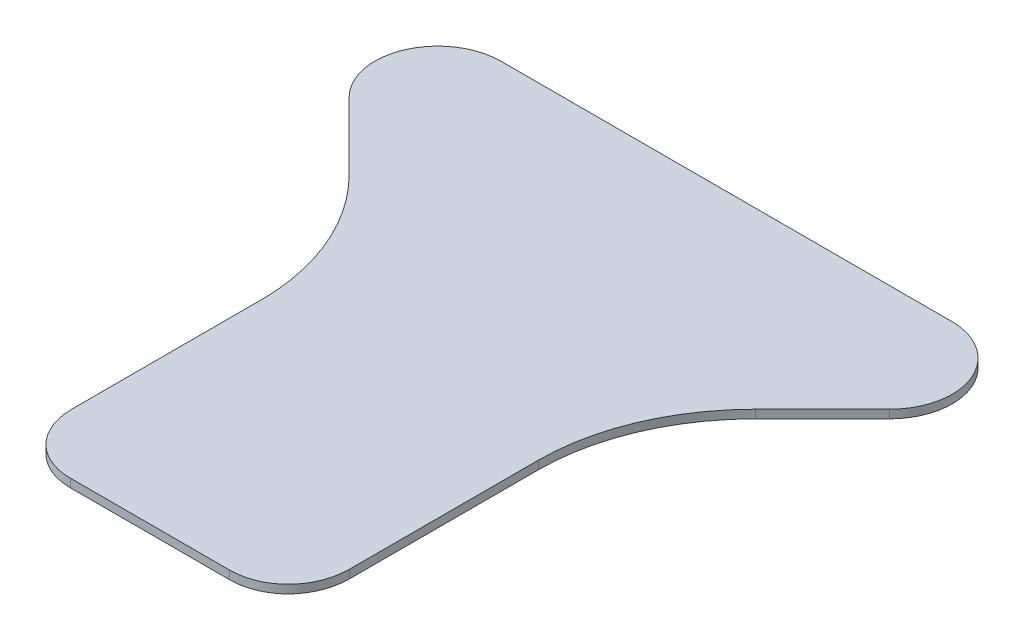
ISO-10303-21;
HEADER;
FILE_DESCRIPTION(('STEP AP214'),'2;1');
FILE_NAME('part.step','',(''),(''),'','','');
FILE_SCHEMA(('AUTOMOTIVE_DESIGN { 1 0 10303 214 1 1 1 1 }'));
ENDSEC;
DATA;
#1=APPLICATION_CONTEXT('core data for automotive mechanical design processes');
#2=APPLICATION_PROTOCOL_DEFINITION('international standard','automotive_design',2000,#1);
#3=PRODUCT_CONTEXT('',#1,'mechanical');
#4=PRODUCT('Part','Part','',(#3));
#5=PRODUCT_RELATED_PRODUCT_CATEGORY('part','',(#4));
#6=PRODUCT_DEFINITION_FORMATION('','',#4);
#7=PRODUCT_DEFINITION_CONTEXT('part definition',#1,'design');
#8=PRODUCT_DEFINITION('design','',#6,#7);
#9=PRODUCT_DEFINITION_SHAPE('','',#8);
#10=(LENGTH_UNIT() NAMED_UNIT(*) SI_UNIT(.MILLI.,.METRE.));
#11=(NAMED_UNIT(*) PLANE_ANGLE_UNIT() SI_UNIT($,.RADIAN.));
#12=(NAMED_UNIT(*) SI_UNIT($,.STERADIAN.) SOLID_ANGLE_UNIT());
#13=UNCERTAINTY_MEASURE_WITH_UNIT(LENGTH_MEASURE(1.E-05),#10,'distance_accuracy_value','');
#14=(GEOMETRIC_REPRESENTATION_CONTEXT(3) GLOBAL_UNCERTAINTY_ASSIGNED_CONTEXT((#13)) GLOBAL_UNIT_ASSIGNED_CONTEXT((#10,
#11,#12)) REPRESENTATION_CONTEXT('',''));
#15=CARTESIAN_POINT('',(0.,0.,0.));
#16=DIRECTION('',(0.,0.,1.));
#17=DIRECTION('',(1.,0.,0.));
#18=AXIS2_PLACEMENT_3D('',#15,#16,#17);
#19=CARTESIAN_POINT('',(84.8907420615577,-2.,16.1883201048479));
#20=DIRECTION('',(0.,-1.,0.));
#21=DIRECTION('',(0.8805517435296,0.,-0.473950025811774));
#22=AXIS2_PLACEMENT_3D('',#19,#20,#21);
#23=ELLIPSE('',#22,52.263673371764,50.);
#24=DIRECTION('',(0.,1.,0.));
#25=VECTOR('',#24,1.);
#26=SURFACE_OF_LINEAR_EXTRUSION('',#23,#25);
#27=CARTESIAN_POINT('',(84.8907420615577,0.,16.1883201048479));
#28=DIRECTION('',(0.,-1.,0.));
#29=DIRECTION('',(0.8805517435296,0.,-0.473950025811774));
#30=AXIS2_PLACEMENT_3D('',#27,#28,#29);
#31=ELLIPSE('',#30,52.263673371764,50.);
#32=CARTESIAN_POINT('',(33.1269330410536,0.,18.0546841412167));
#33=VERTEX_POINT('',#32);
#34=CARTESIAN_POINT('',(48.5022751971715,0.,-18.4039944524139));
#35=VERTEX_POINT('',#34);
#36=EDGE_CURVE('E257',#33,#35,#31,.T.);
#37=ORIENTED_EDGE('',*,*,#36,.F.);
#38=DIRECTION('',(0.,1.,0.));
#39=VECTOR('',#38,1.);
#40=CARTESIAN_POINT('',(33.1269330410536,-2.,18.0546841412167));
#41=LINE('',#40,#39);
#42=CARTESIAN_POINT('',(33.1269330410536,-2.,18.0546841412167));
#43=VERTEX_POINT('',#42);
#44=EDGE_CURVE('E11',#43,#33,#41,.T.);
#45=ORIENTED_EDGE('',*,*,#44,.F.);
#46=CARTESIAN_POINT('',(48.5022751971715,-2.,-18.4039944524139));
#47=VERTEX_POINT('',#46);
#48=EDGE_CURVE('E231',#43,#47,#23,.T.);
#49=ORIENTED_EDGE('',*,*,#48,.T.);
#50=DIRECTION('',(0.,1.,0.));
#51=VECTOR('',#50,1.);
#52=CARTESIAN_POINT('',(48.5022751971715,-2.,-18.4039944524139));
#53=LINE('',#52,#51);
#54=EDGE_CURVE('E37',#47,#35,#53,.T.);
#55=ORIENTED_EDGE('',*,*,#54,.T.);
#56=EDGE_LOOP('',(#37,#45,#49,#55));
#57=FACE_BOUND('',#56,.T.);
#58=ADVANCED_FACE('F33',(#57),#26,.T.);
#59=CARTESIAN_POINT('',(33.1269330410536,-2.,63.0937447596294));
#60=DIRECTION('',(1.,0.,0.));
#61=DIRECTION('',(0.,0.,-1.));
#62=AXIS2_PLACEMENT_3D('',#59,#60,#61);
#63=PLANE('',#62);
#64=DIRECTION('',(0.,0.,-1.));
#65=VECTOR('',#64,1.);
#66=CARTESIAN_POINT('',(33.1269330410536,0.,63.0937447596294));
#67=LINE('',#66,#65);
#68=CARTESIAN_POINT('',(33.1269330410536,0.,63.0937447596294));
#69=VERTEX_POINT('',#68);
#70=EDGE_CURVE('E214',#69,#33,#67,.T.);
#71=ORIENTED_EDGE('',*,*,#70,.F.);
#72=DIRECTION('',(0.,1.,0.));
#73=VECTOR('',#72,1.);
#74=CARTESIAN_POINT('',(33.1269330410536,-2.,63.0937447596294));
#75=LINE('',#74,#73);
#76=CARTESIAN_POINT('',(33.1269330410536,-2.,63.0937447596294));
#77=VERTEX_POINT('',#76);
#78=EDGE_CURVE('E43',#77,#69,#75,.T.);
#79=ORIENTED_EDGE('',*,*,#78,.F.);
#80=DIRECTION('',(0.,0.,-1.));
#81=VECTOR('',#80,1.);
#82=CARTESIAN_POINT('',(33.1269330410536,-2.,63.0937447596294));
#83=LINE('',#82,#81);
#84=EDGE_CURVE('E145',#77,#43,#83,.T.);
#85=ORIENTED_EDGE('',*,*,#84,.T.);
#86=ORIENTED_EDGE('',*,*,#44,.T.);
#87=EDGE_LOOP('',(#71,#79,#85,#86));
#88=FACE_BOUND('',#87,.T.);
#89=ADVANCED_FACE('F161',(#88),#63,.T.);
#90=CARTESIAN_POINT('',(17.5977903349023,-2.,61.6807083324516));
#91=DIRECTION('',(0.,1.,0.));
#92=DIRECTION('',(-0.592855683220724,0.,-0.805308722710048));
#93=AXIS2_PLACEMENT_3D('',#90,#91,#92);
#94=ELLIPSE('',#93,16.4608929818575,15.);
#95=DIRECTION('',(0.,1.,0.));
#96=VECTOR('',#95,1.);
#97=SURFACE_OF_LINEAR_EXTRUSION('',#94,#96);
#98=CARTESIAN_POINT('',(17.5977903349023,0.,61.6807083324516));
#99=DIRECTION('',(0.,1.,0.));
#100=DIRECTION('',(-0.592855683220724,0.,-0.805308722710048));
#101=AXIS2_PLACEMENT_3D('',#98,#99,#100);
#102=ELLIPSE('',#101,16.4608929818575,15.);
#103=CARTESIAN_POINT('',(18.9724506528917,0.,77.6433749195903));
#104=VERTEX_POINT('',#103);
#105=EDGE_CURVE('E132',#104,#69,#102,.T.);
#106=ORIENTED_EDGE('',*,*,#105,.F.);
#107=DIRECTION('',(0.,1.,0.));
#108=VECTOR('',#107,1.);
#109=CARTESIAN_POINT('',(18.9724506528917,-2.,77.6433749195903));
#110=LINE('',#109,#108);
#111=CARTESIAN_POINT('',(18.9724506528917,-2.,77.6433749195903));
#112=VERTEX_POINT('',#111);
#113=EDGE_CURVE('E127',#112,#104,#110,.T.);
#114=ORIENTED_EDGE('',*,*,#113,.F.);
#115=EDGE_CURVE('E130',#112,#77,#94,.T.);
#116=ORIENTED_EDGE('',*,*,#115,.T.);
#117=ORIENTED_EDGE('',*,*,#78,.T.);
#118=EDGE_LOOP('',(#106,#114,#116,#117));
#119=FACE_BOUND('',#118,.T.);
#120=ADVANCED_FACE('F129',(#119),#97,.T.);
#121=CARTESIAN_POINT('',(-18.9724506528917,-2.,77.6433749195903));
#122=DIRECTION('',(0.,0.,1.));
#123=DIRECTION('',(1.,0.,0.));
#124=AXIS2_PLACEMENT_3D('',#121,#122,#123);
#125=PLANE('',#124);
#126=DIRECTION('',(1.,0.,0.));
#127=VECTOR('',#126,1.);
#128=CARTESIAN_POINT('',(-18.9724506528917,0.,77.6433749195903));
#129=LINE('',#128,#127);
#130=CARTESIAN_POINT('',(-18.9724506528917,0.,77.6433749195903));
#131=VERTEX_POINT('',#130);
#132=EDGE_CURVE('E221',#131,#104,#129,.T.);
#133=ORIENTED_EDGE('',*,*,#132,.F.);
#134=DIRECTION('',(0.,1.,0.));
#135=VECTOR('',#134,1.);
#136=CARTESIAN_POINT('',(-18.9724506528917,-2.,77.6433749195903));
#137=LINE('',#136,#135);
#138=CARTESIAN_POINT('',(-18.9724506528917,-2.,77.6433749195903));
#139=VERTEX_POINT('',#138);
#140=EDGE_CURVE('E137',#139,#131,#137,.T.);
#141=ORIENTED_EDGE('',*,*,#140,.F.);
#142=DIRECTION('',(1.,0.,0.));
#143=VECTOR('',#142,1.);
#144=CARTESIAN_POINT('',(-18.9724506528917,-2.,77.6433749195903));
#145=LINE('',#144,#143);
#146=EDGE_CURVE('E143',#139,#112,#145,.T.);
#147=ORIENTED_EDGE('',*,*,#146,.T.);
#148=ORIENTED_EDGE('',*,*,#113,.T.);
#149=EDGE_LOOP('',(#133,#141,#147,#148));
#150=FACE_BOUND('',#149,.T.);
#151=ADVANCED_FACE('F147',(#150),#125,.T.);
#152=CARTESIAN_POINT('',(-17.5977903349023,-2.,61.6807083324516));
#153=DIRECTION('',(0.,1.,0.));
#154=DIRECTION('',(0.592855683220724,0.,-0.805308722710048));
#155=AXIS2_PLACEMENT_3D('',#152,#153,#154);
#156=ELLIPSE('',#155,16.4608929818575,15.);
#157=DIRECTION('',(0.,1.,0.));
#158=VECTOR('',#157,1.);
#159=SURFACE_OF_LINEAR_EXTRUSION('',#156,#158);
#160=CARTESIAN_POINT('',(-17.5977903349023,0.,61.6807083324516));
#161=DIRECTION('',(0.,1.,0.));
#162=DIRECTION('',(0.592855683220724,0.,-0.805308722710048));
#163=AXIS2_PLACEMENT_3D('',#160,#161,#162);
#164=ELLIPSE('',#163,16.4608929818575,15.);
#165=CARTESIAN_POINT('',(-33.1269330410536,0.,63.0937447596294));
#166=VERTEX_POINT('',#165);
#167=EDGE_CURVE('E219',#166,#131,#164,.T.);
#168=ORIENTED_EDGE('',*,*,#167,.F.);
#169=DIRECTION('',(0.,1.,0.));
#170=VECTOR('',#169,1.);
#171=CARTESIAN_POINT('',(-33.1269330410536,-2.,63.0937447596294));
#172=LINE('',#171,#170);
#173=CARTESIAN_POINT('',(-33.1269330410536,-2.,63.0937447596294));
#174=VERTEX_POINT('',#173);
#175=EDGE_CURVE('E189',#174,#166,#172,.T.);
#176=ORIENTED_EDGE('',*,*,#175,.F.);
#177=EDGE_CURVE('E148',#174,#139,#156,.T.);
#178=ORIENTED_EDGE('',*,*,#177,.T.);
#179=ORIENTED_EDGE('',*,*,#140,.T.);
#180=EDGE_LOOP('',(#168,#176,#178,#179));
#181=FACE_BOUND('',#180,.T.);
#182=ADVANCED_FACE('F165',(#181),#159,.T.);
#183=CARTESIAN_POINT('',(-33.1269330410536,-2.,18.0546841412167));
#184=DIRECTION('',(-1.,0.,0.));
#185=DIRECTION('',(0.,0.,1.));
#186=AXIS2_PLACEMENT_3D('',#183,#184,#185);
#187=PLANE('',#186);
#188=DIRECTION('',(0.,0.,1.));
#189=VECTOR('',#188,1.);
#190=CARTESIAN_POINT('',(-33.1269330410536,0.,18.0546841412167));
#191=LINE('',#190,#189);
#192=CARTESIAN_POINT('',(-33.1269330410536,0.,18.0546841412167));
#193=VERTEX_POINT('',#192);
#194=EDGE_CURVE('E226',#193,#166,#191,.T.);
#195=ORIENTED_EDGE('',*,*,#194,.F.);
#196=DIRECTION('',(0.,1.,0.));
#197=VECTOR('',#196,1.);
#198=CARTESIAN_POINT('',(-33.1269330410536,-2.,18.0546841412167));
#199=LINE('',#198,#197);
#200=CARTESIAN_POINT('',(-33.1269330410536,-2.,18.0546841412167));
#201=VERTEX_POINT('',#200);
#202=EDGE_CURVE('E191',#201,#193,#199,.T.);
#203=ORIENTED_EDGE('',*,*,#202,.F.);
#204=DIRECTION('',(0.,0.,1.));
#205=VECTOR('',#204,1.);
#206=CARTESIAN_POINT('',(-33.1269330410536,-2.,18.0546841412167));
#207=LINE('',#206,#205);
#208=EDGE_CURVE('E150',#201,#174,#207,.T.);
#209=ORIENTED_EDGE('',*,*,#208,.T.);
#210=ORIENTED_EDGE('',*,*,#175,.T.);
#211=EDGE_LOOP('',(#195,#203,#209,#210));
#212=FACE_BOUND('',#211,.T.);
#213=ADVANCED_FACE('F168',(#212),#187,.T.);
#214=CARTESIAN_POINT('',(-84.8907420615577,-2.,16.1883201048479));
#215=DIRECTION('',(0.,-1.,0.));
#216=DIRECTION('',(-0.8805517435296,0.,-0.473950025811774));
#217=AXIS2_PLACEMENT_3D('',#214,#215,#216);
#218=ELLIPSE('',#217,52.263673371764,50.);
#219=DIRECTION('',(0.,1.,0.));
#220=VECTOR('',#219,1.);
#221=SURFACE_OF_LINEAR_EXTRUSION('',#218,#220);
#222=CARTESIAN_POINT('',(-84.8907420615577,0.,16.1883201048479));
#223=DIRECTION('',(0.,-1.,0.));
#224=DIRECTION('',(-0.8805517435296,0.,-0.473950025811774));
#225=AXIS2_PLACEMENT_3D('',#222,#223,#224);
#226=ELLIPSE('',#225,52.263673371764,50.);
#227=CARTESIAN_POINT('',(-48.5022751971715,0.,-18.4039944524139));
#228=VERTEX_POINT('',#227);
#229=EDGE_CURVE('E198',#228,#193,#226,.T.);
#230=ORIENTED_EDGE('',*,*,#229,.F.);
#231=DIRECTION('',(0.,1.,0.));
#232=VECTOR('',#231,1.);
#233=CARTESIAN_POINT('',(-48.5022751971715,-2.,-18.4039944524139));
#234=LINE('',#233,#232);
#235=CARTESIAN_POINT('',(-48.5022751971715,-2.,-18.4039944524139));
#236=VERTEX_POINT('',#235);
#237=EDGE_CURVE('E196',#236,#228,#234,.T.);
#238=ORIENTED_EDGE('',*,*,#237,.F.);
#239=EDGE_CURVE('E180',#236,#201,#218,.T.);
#240=ORIENTED_EDGE('',*,*,#239,.T.);
#241=ORIENTED_EDGE('',*,*,#202,.T.);
#242=EDGE_LOOP('',(#230,#238,#240,#241));
#243=FACE_BOUND('',#242,.T.);
#244=ADVANCED_FACE('F172',(#243),#221,.T.);
#245=CARTESIAN_POINT('',(-64.5320403487164,-2.,-34.4337596039586));
#246=DIRECTION('',(-0.707106781186543,0.,0.707106781186552));
#247=DIRECTION('',(0.707106781186552,0.,0.707106781186543));
#248=AXIS2_PLACEMENT_3D('',#245,#246,#247);
#249=PLANE('',#248);
#250=DIRECTION('',(0.707106781186552,0.,0.707106781186543));
#251=VECTOR('',#250,1.);
#252=CARTESIAN_POINT('',(-64.5320403487164,0.,-34.4337596039586));
#253=LINE('',#252,#251);
#254=CARTESIAN_POINT('',(-64.5320403487164,0.,-34.4337596039586));
#255=VERTEX_POINT('',#254);
#256=EDGE_CURVE('E271',#255,#228,#253,.T.);
#257=ORIENTED_EDGE('',*,*,#256,.F.);
#258=DIRECTION('',(0.,1.,0.));
#259=VECTOR('',#258,1.);
#260=CARTESIAN_POINT('',(-64.5320403487164,-2.,-34.4337596039586));
#261=LINE('',#260,#259);
#262=CARTESIAN_POINT('',(-64.5320403487164,-2.,-34.4337596039586));
#263=VERTEX_POINT('',#262);
#264=EDGE_CURVE('E202',#263,#255,#261,.T.);
#265=ORIENTED_EDGE('',*,*,#264,.F.);
#266=DIRECTION('',(0.707106781186552,0.,0.707106781186543));
#267=VECTOR('',#266,1.);
#268=CARTESIAN_POINT('',(-64.5320403487164,-2.,-34.4337596039586));
#269=LINE('',#268,#267);
#270=EDGE_CURVE('E184',#263,#236,#269,.T.);
#271=ORIENTED_EDGE('',*,*,#270,.T.);
#272=ORIENTED_EDGE('',*,*,#237,.T.);
#273=EDGE_LOOP('',(#257,#265,#271,#272));
#274=FACE_BOUND('',#273,.T.);
#275=ADVANCED_FACE('F177',(#274),#249,.T.);
#276=CARTESIAN_POINT('',(-53.8040463182635,-2.,-45.));
#277=DIRECTION('',(0.,1.,0.));
#278=DIRECTION('',(1.,0.,0.));
#279=AXIS2_PLACEMENT_3D('',#276,#277,#278);
#280=ELLIPSE('',#279,15.1143779167552,15.);
#281=DIRECTION('',(0.,1.,0.));
#282=VECTOR('',#281,1.);
#283=SURFACE_OF_LINEAR_EXTRUSION('',#280,#282);
#284=CARTESIAN_POINT('',(-53.8040463182635,0.,-45.));
#285=DIRECTION('',(0.,1.,0.));
#286=DIRECTION('',(1.,0.,0.));
#287=AXIS2_PLACEMENT_3D('',#284,#285,#286);
#288=ELLIPSE('',#287,15.1143779167552,15.);
#289=CARTESIAN_POINT('',(-53.8040463182635,0.,-60.));
#290=VERTEX_POINT('',#289);
#291=EDGE_CURVE('E268',#290,#255,#288,.T.);
#292=ORIENTED_EDGE('',*,*,#291,.F.);
#293=DIRECTION('',(0.,1.,0.));
#294=VECTOR('',#293,1.);
#295=CARTESIAN_POINT('',(-53.8040463182635,-2.,-60.));
#296=LINE('',#295,#294);
#297=CARTESIAN_POINT('',(-53.8040463182635,-2.,-60.));
#298=VERTEX_POINT('',#297);
#299=EDGE_CURVE('E205',#298,#290,#296,.T.);
#300=ORIENTED_EDGE('',*,*,#299,.F.);
#301=EDGE_CURVE('E277',#298,#263,#280,.T.);
#302=ORIENTED_EDGE('',*,*,#301,.T.);
#303=ORIENTED_EDGE('',*,*,#264,.T.);
#304=EDGE_LOOP('',(#292,#300,#302,#303));
#305=FACE_BOUND('',#304,.T.);
#306=ADVANCED_FACE('F279',(#305),#283,.T.);
#307=CARTESIAN_POINT('',(53.8040463182635,-2.,-60.));
#308=DIRECTION('',(0.,0.,-1.));
#309=DIRECTION('',(-1.,0.,0.));
#310=AXIS2_PLACEMENT_3D('',#307,#308,#309);
#311=PLANE('',#310);
#312=DIRECTION('',(-1.,0.,0.));
#313=VECTOR('',#312,1.);
#314=CARTESIAN_POINT('',(53.8040463182635,0.,-60.));
#315=LINE('',#314,#313);
#316=CARTESIAN_POINT('',(53.8040463182635,0.,-60.));
#317=VERTEX_POINT('',#316);
#318=EDGE_CURVE('E265',#317,#290,#315,.T.);
#319=ORIENTED_EDGE('',*,*,#318,.F.);
#320=DIRECTION('',(0.,1.,0.));
#321=VECTOR('',#320,1.);
#322=CARTESIAN_POINT('',(53.8040463182635,-2.,-60.));
#323=LINE('',#322,#321);
#324=CARTESIAN_POINT('',(53.8040463182635,-2.,-60.));
#325=VERTEX_POINT('',#324);
#326=EDGE_CURVE('E210',#325,#317,#323,.T.);
#327=ORIENTED_EDGE('',*,*,#326,.F.);
#328=DIRECTION('',(-1.,0.,0.));
#329=VECTOR('',#328,1.);
#330=CARTESIAN_POINT('',(53.8040463182635,-2.,-60.));
#331=LINE('',#330,#329);
#332=EDGE_CURVE('E240',#325,#298,#331,.T.);
#333=ORIENTED_EDGE('',*,*,#332,.T.);
#334=ORIENTED_EDGE('',*,*,#299,.T.);
#335=EDGE_LOOP('',(#319,#327,#333,#334));
#336=FACE_BOUND('',#335,.T.);
#337=ADVANCED_FACE('F246',(#336),#311,.T.);
#338=CARTESIAN_POINT('',(53.8040463182635,-2.,-45.));
#339=DIRECTION('',(0.,1.,0.));
#340=DIRECTION('',(-1.,0.,0.));
#341=AXIS2_PLACEMENT_3D('',#338,#339,#340);
#342=ELLIPSE('',#341,15.1143779167552,15.);
#343=DIRECTION('',(0.,1.,0.));
#344=VECTOR('',#343,1.);
#345=SURFACE_OF_LINEAR_EXTRUSION('',#342,#344);
#346=CARTESIAN_POINT('',(53.8040463182635,0.,-45.));
#347=DIRECTION('',(0.,1.,0.));
#348=DIRECTION('',(-1.,0.,0.));
#349=AXIS2_PLACEMENT_3D('',#346,#347,#348);
#350=ELLIPSE('',#349,15.1143779167552,15.);
#351=CARTESIAN_POINT('',(64.5320403487164,0.,-34.4337596039586));
#352=VERTEX_POINT('',#351);
#353=EDGE_CURVE('E260',#352,#317,#350,.T.);
#354=ORIENTED_EDGE('',*,*,#353,.F.);
#355=DIRECTION('',(0.,1.,0.));
#356=VECTOR('',#355,1.);
#357=CARTESIAN_POINT('',(64.5320403487164,-2.,-34.4337596039586));
#358=LINE('',#357,#356);
#359=CARTESIAN_POINT('',(64.5320403487164,-2.,-34.4337596039586));
#360=VERTEX_POINT('',#359);
#361=EDGE_CURVE('E211',#360,#352,#358,.T.);
#362=ORIENTED_EDGE('',*,*,#361,.F.);
#363=EDGE_CURVE('E233',#360,#325,#342,.T.);
#364=ORIENTED_EDGE('',*,*,#363,.T.);
#365=ORIENTED_EDGE('',*,*,#326,.T.);
#366=EDGE_LOOP('',(#354,#362,#364,#365));
#367=FACE_BOUND('',#366,.T.);
#368=ADVANCED_FACE('F242',(#367),#345,.T.);
#369=CARTESIAN_POINT('',(48.5022751971715,-2.,-18.4039944524139));
#370=DIRECTION('',(0.707106781186543,0.,0.707106781186552));
#371=DIRECTION('',(0.707106781186552,0.,-0.707106781186543));
#372=AXIS2_PLACEMENT_3D('',#369,#370,#371);
#373=PLANE('',#372);
#374=DIRECTION('',(0.707106781186552,0.,-0.707106781186543));
#375=VECTOR('',#374,1.);
#376=CARTESIAN_POINT('',(48.5022751971715,0.,-18.4039944524139));
#377=LINE('',#376,#375);
#378=EDGE_CURVE('E259',#35,#352,#377,.T.);
#379=ORIENTED_EDGE('',*,*,#378,.F.);
#380=ORIENTED_EDGE('',*,*,#54,.F.);
#381=DIRECTION('',(0.707106781186552,0.,-0.707106781186543));
#382=VECTOR('',#381,1.);
#383=CARTESIAN_POINT('',(48.5022751971715,-2.,-18.4039944524139));
#384=LINE('',#383,#382);
#385=EDGE_CURVE('E232',#47,#360,#384,.T.);
#386=ORIENTED_EDGE('',*,*,#385,.T.);
#387=ORIENTED_EDGE('',*,*,#361,.T.);
#388=EDGE_LOOP('',(#379,#380,#386,#387));
#389=FACE_BOUND('',#388,.T.);
#390=ADVANCED_FACE('F245',(#389),#373,.T.);
#391=CARTESIAN_POINT('',(84.8907420615577,-2.,16.1883201048479));
#392=DIRECTION('',(0.,1.,0.));
#393=DIRECTION('',(0.,0.,1.));
#394=AXIS2_PLACEMENT_3D('',#391,#392,#393);
#395=PLANE('',#394);
#396=ORIENTED_EDGE('',*,*,#48,.F.);
#397=ORIENTED_EDGE('',*,*,#84,.F.);
#398=ORIENTED_EDGE('',*,*,#115,.F.);
#399=ORIENTED_EDGE('',*,*,#146,.F.);
#400=ORIENTED_EDGE('',*,*,#177,.F.);
#401=ORIENTED_EDGE('',*,*,#208,.F.);
#402=ORIENTED_EDGE('',*,*,#239,.F.);
#403=ORIENTED_EDGE('',*,*,#270,.F.);
#404=ORIENTED_EDGE('',*,*,#301,.F.);
#405=ORIENTED_EDGE('',*,*,#332,.F.);
#406=ORIENTED_EDGE('',*,*,#363,.F.);
#407=ORIENTED_EDGE('',*,*,#385,.F.);
#408=EDGE_LOOP('',(#396,#397,#398,#399,#400,#401,#402,#403,#404,#405,#406,#407));
#409=FACE_BOUND('',#408,.T.);
#410=ADVANCED_FACE('F141',(#409),#395,.F.);
#411=CARTESIAN_POINT('',(84.8907420615577,0.,16.1883201048479));
#412=DIRECTION('',(0.,1.,0.));
#413=DIRECTION('',(0.,0.,1.));
#414=AXIS2_PLACEMENT_3D('',#411,#412,#413);
#415=PLANE('',#414);
#416=ORIENTED_EDGE('',*,*,#36,.T.);
#417=ORIENTED_EDGE('',*,*,#378,.T.);
#418=ORIENTED_EDGE('',*,*,#353,.T.);
#419=ORIENTED_EDGE('',*,*,#318,.T.);
#420=ORIENTED_EDGE('',*,*,#291,.T.);
#421=ORIENTED_EDGE('',*,*,#256,.T.);
#422=ORIENTED_EDGE('',*,*,#229,.T.);
#423=ORIENTED_EDGE('',*,*,#194,.T.);
#424=ORIENTED_EDGE('',*,*,#167,.T.);
#425=ORIENTED_EDGE('',*,*,#132,.T.);
#426=ORIENTED_EDGE('',*,*,#105,.T.);
#427=ORIENTED_EDGE('',*,*,#70,.T.);
#428=EDGE_LOOP('',(#416,#417,#418,#419,#420,#421,#422,#423,#424,#425,#426,#427));
#429=FACE_BOUND('',#428,.T.);
#430=ADVANCED_FACE('F225',(#429),#415,.T.);
#431=CLOSED_SHELL('',(#58,#89,#120,#151,#182,#213,#244,#275,#306,#337,#368,#390,#410,#430));
#432=MANIFOLD_SOLID_BREP('B2',#431);
#433=ADVANCED_BREP_SHAPE_REPRESENTATION('',(#18,#432),#14);
#434=SHAPE_DEFINITION_REPRESENTATION(#9,#433);
ENDSEC;
END-ISO-10303-21;
